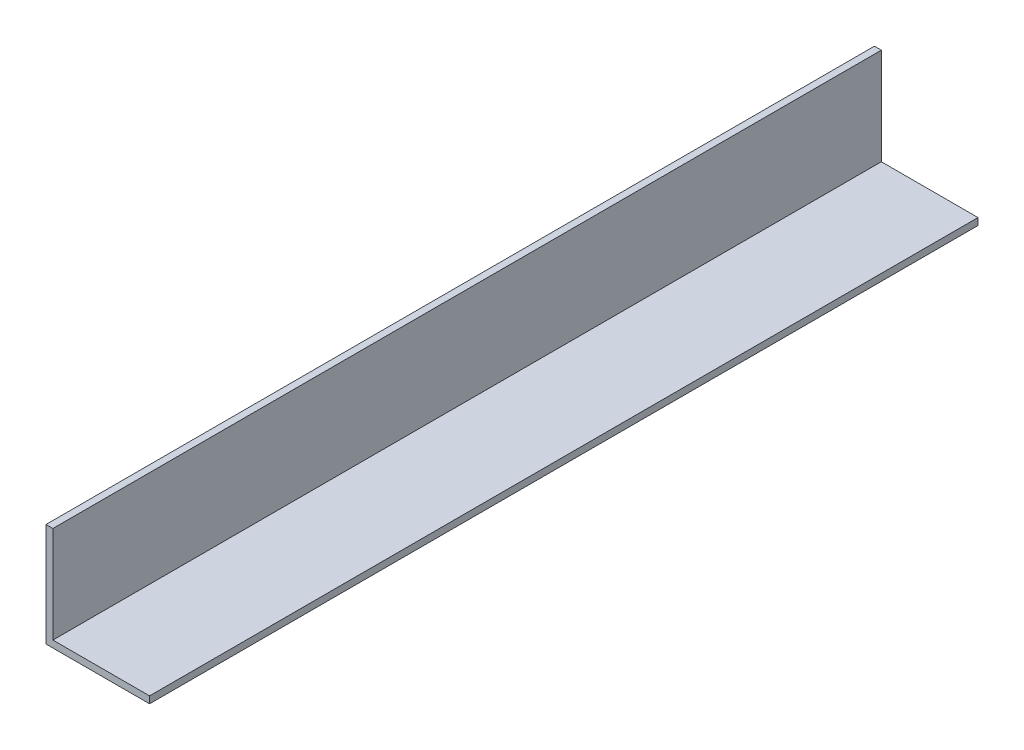
ISO-10303-21;
HEADER;
FILE_DESCRIPTION(('STEP AP214'),'2;1');
FILE_NAME('part.step','',(''),(''),'','','');
FILE_SCHEMA(('AUTOMOTIVE_DESIGN { 1 0 10303 214 1 1 1 1 }'));
ENDSEC;
DATA;
#1=APPLICATION_CONTEXT('core data for automotive mechanical design processes');
#2=APPLICATION_PROTOCOL_DEFINITION('international standard','automotive_design',2000,#1);
#3=PRODUCT_CONTEXT('',#1,'mechanical');
#4=PRODUCT('Part','Part','',(#3));
#5=PRODUCT_RELATED_PRODUCT_CATEGORY('part','',(#4));
#6=PRODUCT_DEFINITION_FORMATION('','',#4);
#7=PRODUCT_DEFINITION_CONTEXT('part definition',#1,'design');
#8=PRODUCT_DEFINITION('design','',#6,#7);
#9=PRODUCT_DEFINITION_SHAPE('','',#8);
#10=(LENGTH_UNIT() NAMED_UNIT(*) SI_UNIT(.MILLI.,.METRE.));
#11=(NAMED_UNIT(*) PLANE_ANGLE_UNIT() SI_UNIT($,.RADIAN.));
#12=(NAMED_UNIT(*) SI_UNIT($,.STERADIAN.) SOLID_ANGLE_UNIT());
#13=UNCERTAINTY_MEASURE_WITH_UNIT(LENGTH_MEASURE(1.E-05),#10,'distance_accuracy_value','');
#14=(GEOMETRIC_REPRESENTATION_CONTEXT(3) GLOBAL_UNCERTAINTY_ASSIGNED_CONTEXT((#13)) GLOBAL_UNIT_ASSIGNED_CONTEXT((#10,
#11,#12)) REPRESENTATION_CONTEXT('',''));
#15=CARTESIAN_POINT('',(0.,0.,0.));
#16=DIRECTION('',(0.,0.,1.));
#17=DIRECTION('',(1.,0.,0.));
#18=AXIS2_PLACEMENT_3D('',#15,#16,#17);
#19=CARTESIAN_POINT('',(0.,30.,240.));
#20=DIRECTION('',(1.,0.,0.));
#21=DIRECTION('',(0.,1.,0.));
#22=AXIS2_PLACEMENT_3D('',#19,#20,#21);
#23=PLANE('',#22);
#24=DIRECTION('',(0.,-1.,0.));
#25=VECTOR('',#24,1.);
#26=CARTESIAN_POINT('',(0.,30.,0.));
#27=LINE('',#26,#25);
#28=CARTESIAN_POINT('',(0.,30.,0.));
#29=VERTEX_POINT('',#28);
#30=CARTESIAN_POINT('',(0.,0.,0.));
#31=VERTEX_POINT('',#30);
#32=EDGE_CURVE('E128',#29,#31,#27,.T.);
#33=ORIENTED_EDGE('',*,*,#32,.T.);
#34=DIRECTION('',(0.,0.,-1.));
#35=VECTOR('',#34,1.);
#36=CARTESIAN_POINT('',(0.,0.,240.));
#37=LINE('',#36,#35);
#38=CARTESIAN_POINT('',(0.,0.,240.));
#39=VERTEX_POINT('',#38);
#40=EDGE_CURVE('E11',#39,#31,#37,.T.);
#41=ORIENTED_EDGE('',*,*,#40,.F.);
#42=DIRECTION('',(0.,-1.,0.));
#43=VECTOR('',#42,1.);
#44=CARTESIAN_POINT('',(0.,30.,240.));
#45=LINE('',#44,#43);
#46=CARTESIAN_POINT('',(0.,30.,240.));
#47=VERTEX_POINT('',#46);
#48=EDGE_CURVE('E144',#47,#39,#45,.T.);
#49=ORIENTED_EDGE('',*,*,#48,.F.);
#50=DIRECTION('',(0.,0.,-1.));
#51=VECTOR('',#50,1.);
#52=CARTESIAN_POINT('',(0.,30.,240.));
#53=LINE('',#52,#51);
#54=EDGE_CURVE('E124',#47,#29,#53,.T.);
#55=ORIENTED_EDGE('',*,*,#54,.T.);
#56=EDGE_LOOP('',(#33,#41,#49,#55));
#57=FACE_BOUND('',#56,.T.);
#58=ADVANCED_FACE('F39',(#57),#23,.F.);
#59=CARTESIAN_POINT('',(0.,0.,240.));
#60=DIRECTION('',(0.,1.,0.));
#61=DIRECTION('',(0.,0.,1.));
#62=AXIS2_PLACEMENT_3D('',#59,#60,#61);
#63=PLANE('',#62);
#64=DIRECTION('',(1.,0.,0.));
#65=VECTOR('',#64,1.);
#66=CARTESIAN_POINT('',(0.,0.,0.));
#67=LINE('',#66,#65);
#68=CARTESIAN_POINT('',(30.,0.,0.));
#69=VERTEX_POINT('',#68);
#70=EDGE_CURVE('E132',#31,#69,#67,.T.);
#71=ORIENTED_EDGE('',*,*,#70,.T.);
#72=DIRECTION('',(0.,0.,-1.));
#73=VECTOR('',#72,1.);
#74=CARTESIAN_POINT('',(30.,0.,240.));
#75=LINE('',#74,#73);
#76=CARTESIAN_POINT('',(30.,0.,240.));
#77=VERTEX_POINT('',#76);
#78=EDGE_CURVE('E48',#77,#69,#75,.T.);
#79=ORIENTED_EDGE('',*,*,#78,.F.);
#80=DIRECTION('',(1.,0.,0.));
#81=VECTOR('',#80,1.);
#82=CARTESIAN_POINT('',(0.,0.,240.));
#83=LINE('',#82,#81);
#84=EDGE_CURVE('E93',#39,#77,#83,.T.);
#85=ORIENTED_EDGE('',*,*,#84,.F.);
#86=ORIENTED_EDGE('',*,*,#40,.T.);
#87=EDGE_LOOP('',(#71,#79,#85,#86));
#88=FACE_BOUND('',#87,.T.);
#89=ADVANCED_FACE('F172',(#88),#63,.F.);
#90=CARTESIAN_POINT('',(30.,0.,240.));
#91=DIRECTION('',(-1.,0.,0.));
#92=DIRECTION('',(0.,0.,1.));
#93=AXIS2_PLACEMENT_3D('',#90,#91,#92);
#94=PLANE('',#93);
#95=DIRECTION('',(0.,1.,0.));
#96=VECTOR('',#95,1.);
#97=CARTESIAN_POINT('',(30.,0.,0.));
#98=LINE('',#97,#96);
#99=CARTESIAN_POINT('',(30.,2.,0.));
#100=VERTEX_POINT('',#99);
#101=EDGE_CURVE('E135',#69,#100,#98,.T.);
#102=ORIENTED_EDGE('',*,*,#101,.T.);
#103=DIRECTION('',(0.,0.,-1.));
#104=VECTOR('',#103,1.);
#105=CARTESIAN_POINT('',(30.,2.,240.));
#106=LINE('',#105,#104);
#107=CARTESIAN_POINT('',(30.,2.,240.));
#108=VERTEX_POINT('',#107);
#109=EDGE_CURVE('E117',#108,#100,#106,.T.);
#110=ORIENTED_EDGE('',*,*,#109,.F.);
#111=DIRECTION('',(0.,1.,0.));
#112=VECTOR('',#111,1.);
#113=CARTESIAN_POINT('',(30.,0.,240.));
#114=LINE('',#113,#112);
#115=EDGE_CURVE('E106',#77,#108,#114,.T.);
#116=ORIENTED_EDGE('',*,*,#115,.F.);
#117=ORIENTED_EDGE('',*,*,#78,.T.);
#118=EDGE_LOOP('',(#102,#110,#116,#117));
#119=FACE_BOUND('',#118,.T.);
#120=ADVANCED_FACE('F154',(#119),#94,.F.);
#121=CARTESIAN_POINT('',(30.,2.,240.));
#122=DIRECTION('',(0.,-1.,0.));
#123=DIRECTION('',(1.,0.,0.));
#124=AXIS2_PLACEMENT_3D('',#121,#122,#123);
#125=PLANE('',#124);
#126=DIRECTION('',(-1.,0.,0.));
#127=VECTOR('',#126,1.);
#128=CARTESIAN_POINT('',(30.,2.,0.));
#129=LINE('',#128,#127);
#130=CARTESIAN_POINT('',(2.,2.,0.));
#131=VERTEX_POINT('',#130);
#132=EDGE_CURVE('E115',#100,#131,#129,.T.);
#133=ORIENTED_EDGE('',*,*,#132,.T.);
#134=DIRECTION('',(0.,0.,-1.));
#135=VECTOR('',#134,1.);
#136=CARTESIAN_POINT('',(2.,2.,240.));
#137=LINE('',#136,#135);
#138=CARTESIAN_POINT('',(2.,2.,240.));
#139=VERTEX_POINT('',#138);
#140=EDGE_CURVE('E112',#139,#131,#137,.T.);
#141=ORIENTED_EDGE('',*,*,#140,.F.);
#142=DIRECTION('',(-1.,0.,0.));
#143=VECTOR('',#142,1.);
#144=CARTESIAN_POINT('',(30.,2.,240.));
#145=LINE('',#144,#143);
#146=EDGE_CURVE('E100',#108,#139,#145,.T.);
#147=ORIENTED_EDGE('',*,*,#146,.F.);
#148=ORIENTED_EDGE('',*,*,#109,.T.);
#149=EDGE_LOOP('',(#133,#141,#147,#148));
#150=FACE_BOUND('',#149,.T.);
#151=ADVANCED_FACE('F113',(#150),#125,.F.);
#152=CARTESIAN_POINT('',(2.,2.,240.));
#153=DIRECTION('',(-1.,0.,0.));
#154=DIRECTION('',(0.,-1.,0.));
#155=AXIS2_PLACEMENT_3D('',#152,#153,#154);
#156=PLANE('',#155);
#157=DIRECTION('',(0.,1.,0.));
#158=VECTOR('',#157,1.);
#159=CARTESIAN_POINT('',(2.,2.,0.));
#160=LINE('',#159,#158);
#161=CARTESIAN_POINT('',(2.,30.,0.));
#162=VERTEX_POINT('',#161);
#163=EDGE_CURVE('E79',#131,#162,#160,.T.);
#164=ORIENTED_EDGE('',*,*,#163,.T.);
#165=DIRECTION('',(0.,0.,-1.));
#166=VECTOR('',#165,1.);
#167=CARTESIAN_POINT('',(2.,30.,240.));
#168=LINE('',#167,#166);
#169=CARTESIAN_POINT('',(2.,30.,240.));
#170=VERTEX_POINT('',#169);
#171=EDGE_CURVE('E118',#170,#162,#168,.T.);
#172=ORIENTED_EDGE('',*,*,#171,.F.);
#173=DIRECTION('',(0.,1.,0.));
#174=VECTOR('',#173,1.);
#175=CARTESIAN_POINT('',(2.,2.,240.));
#176=LINE('',#175,#174);
#177=EDGE_CURVE('E104',#139,#170,#176,.T.);
#178=ORIENTED_EDGE('',*,*,#177,.F.);
#179=ORIENTED_EDGE('',*,*,#140,.T.);
#180=EDGE_LOOP('',(#164,#172,#178,#179));
#181=FACE_BOUND('',#180,.T.);
#182=ADVANCED_FACE('F120',(#181),#156,.F.);
#183=CARTESIAN_POINT('',(2.,30.,240.));
#184=DIRECTION('',(0.,-1.,0.));
#185=DIRECTION('',(0.,0.,-1.));
#186=AXIS2_PLACEMENT_3D('',#183,#184,#185);
#187=PLANE('',#186);
#188=DIRECTION('',(-1.,0.,0.));
#189=VECTOR('',#188,1.);
#190=CARTESIAN_POINT('',(2.,30.,0.));
#191=LINE('',#190,#189);
#192=EDGE_CURVE('E85',#162,#29,#191,.T.);
#193=ORIENTED_EDGE('',*,*,#192,.T.);
#194=ORIENTED_EDGE('',*,*,#54,.F.);
#195=DIRECTION('',(-1.,0.,0.));
#196=VECTOR('',#195,1.);
#197=CARTESIAN_POINT('',(2.,30.,240.));
#198=LINE('',#197,#196);
#199=EDGE_CURVE('E56',#170,#47,#198,.T.);
#200=ORIENTED_EDGE('',*,*,#199,.F.);
#201=ORIENTED_EDGE('',*,*,#171,.T.);
#202=EDGE_LOOP('',(#193,#194,#200,#201));
#203=FACE_BOUND('',#202,.T.);
#204=ADVANCED_FACE('F161',(#203),#187,.F.);
#205=CARTESIAN_POINT('',(0.,0.,240.));
#206=DIRECTION('',(0.,0.,1.));
#207=DIRECTION('',(1.,0.,0.));
#208=AXIS2_PLACEMENT_3D('',#205,#206,#207);
#209=PLANE('',#208);
#210=ORIENTED_EDGE('',*,*,#48,.T.);
#211=ORIENTED_EDGE('',*,*,#84,.T.);
#212=ORIENTED_EDGE('',*,*,#115,.T.);
#213=ORIENTED_EDGE('',*,*,#146,.T.);
#214=ORIENTED_EDGE('',*,*,#177,.T.);
#215=ORIENTED_EDGE('',*,*,#199,.T.);
#216=EDGE_LOOP('',(#210,#211,#212,#213,#214,#215));
#217=FACE_BOUND('',#216,.T.);
#218=ADVANCED_FACE('F102',(#217),#209,.T.);
#219=CARTESIAN_POINT('',(0.,0.,0.));
#220=DIRECTION('',(0.,0.,1.));
#221=DIRECTION('',(1.,0.,0.));
#222=AXIS2_PLACEMENT_3D('',#219,#220,#221);
#223=PLANE('',#222);
#224=ORIENTED_EDGE('',*,*,#32,.F.);
#225=ORIENTED_EDGE('',*,*,#192,.F.);
#226=ORIENTED_EDGE('',*,*,#163,.F.);
#227=ORIENTED_EDGE('',*,*,#132,.F.);
#228=ORIENTED_EDGE('',*,*,#101,.F.);
#229=ORIENTED_EDGE('',*,*,#70,.F.);
#230=EDGE_LOOP('',(#224,#225,#226,#227,#228,#229));
#231=FACE_BOUND('',#230,.T.);
#232=ADVANCED_FACE('F157',(#231),#223,.F.);
#233=CLOSED_SHELL('',(#58,#89,#120,#151,#182,#204,#218,#232));
#234=MANIFOLD_SOLID_BREP('B2',#233);
#235=ADVANCED_BREP_SHAPE_REPRESENTATION('',(#18,#234),#14);
#236=SHAPE_DEFINITION_REPRESENTATION(#9,#235);
ENDSEC;
END-ISO-10303-21;
